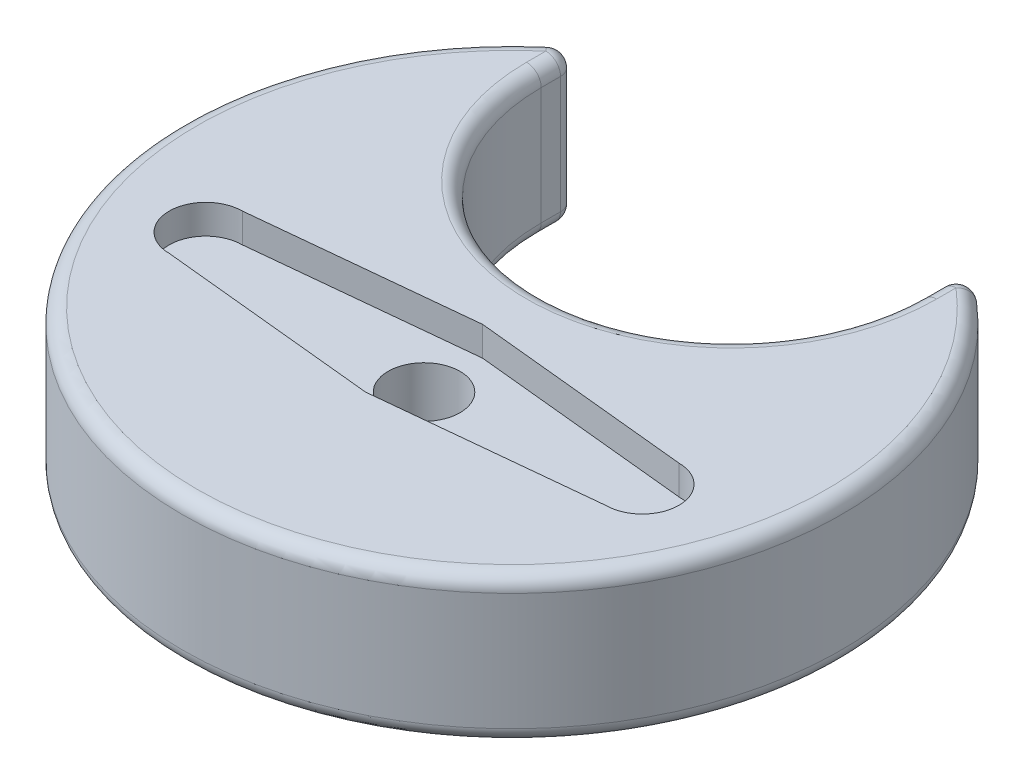
ISO-10303-21;
HEADER;
FILE_DESCRIPTION(('STEP AP214'),'2;1');
FILE_NAME('part.step','',(''),(''),'','','');
FILE_SCHEMA(('AUTOMOTIVE_DESIGN { 1 0 10303 214 1 1 1 1 }'));
ENDSEC;
DATA;
#1=APPLICATION_CONTEXT('core data for automotive mechanical design processes');
#2=APPLICATION_PROTOCOL_DEFINITION('international standard','automotive_design',2000,#1);
#3=PRODUCT_CONTEXT('',#1,'mechanical');
#4=PRODUCT('Part','Part','',(#3));
#5=PRODUCT_RELATED_PRODUCT_CATEGORY('part','',(#4));
#6=PRODUCT_DEFINITION_FORMATION('','',#4);
#7=PRODUCT_DEFINITION_CONTEXT('part definition',#1,'design');
#8=PRODUCT_DEFINITION('design','',#6,#7);
#9=PRODUCT_DEFINITION_SHAPE('','',#8);
#10=(LENGTH_UNIT() NAMED_UNIT(*) SI_UNIT(.MILLI.,.METRE.));
#11=(NAMED_UNIT(*) PLANE_ANGLE_UNIT() SI_UNIT($,.RADIAN.));
#12=(NAMED_UNIT(*) SI_UNIT($,.STERADIAN.) SOLID_ANGLE_UNIT());
#13=UNCERTAINTY_MEASURE_WITH_UNIT(LENGTH_MEASURE(1.E-05),#10,'distance_accuracy_value','');
#14=(GEOMETRIC_REPRESENTATION_CONTEXT(3) GLOBAL_UNCERTAINTY_ASSIGNED_CONTEXT((#13)) GLOBAL_UNIT_ASSIGNED_CONTEXT((#10,
#11,#12)) REPRESENTATION_CONTEXT('',''));
#15=CARTESIAN_POINT('',(0.,0.,0.));
#16=DIRECTION('',(0.,0.,1.));
#17=DIRECTION('',(1.,0.,0.));
#18=AXIS2_PLACEMENT_3D('',#15,#16,#17);
#19=CARTESIAN_POINT('',(14.,10.,-16.3171688720807));
#20=DIRECTION('',(0.,-1.,0.));
#21=DIRECTION('',(0.,0.,-1.));
#22=AXIS2_PLACEMENT_3D('',#19,#20,#21);
#23=CYLINDRICAL_SURFACE('',#22,1.);
#24=DIRECTION('',(0.,-1.,0.));
#25=VECTOR('',#24,1.);
#26=CARTESIAN_POINT('',(14.6511627906977,10.,-17.0761069591542));
#27=LINE('',#26,#25);
#28=CARTESIAN_POINT('',(14.6511627906977,9.,-17.0761069591542));
#29=VERTEX_POINT('',#28);
#30=CARTESIAN_POINT('',(14.6511627906977,0.999999999999999,-17.0761069591542));
#31=VERTEX_POINT('',#30);
#32=EDGE_CURVE('E228',#29,#31,#27,.T.);
#33=ORIENTED_EDGE('',*,*,#32,.T.);
#34=CARTESIAN_POINT('',(14.,0.999999999999999,-16.3171688720807));
#35=DIRECTION('',(0.,-1.,0.));
#36=DIRECTION('',(0.,0.,-1.));
#37=AXIS2_PLACEMENT_3D('',#34,#35,#36);
#38=CIRCLE('',#37,1.);
#39=CARTESIAN_POINT('',(13.,0.999999999999999,-16.3171688720807));
#40=VERTEX_POINT('',#39);
#41=EDGE_CURVE('E299',#31,#40,#38,.F.);
#42=ORIENTED_EDGE('',*,*,#41,.T.);
#43=DIRECTION('',(0.,-1.,0.));
#44=VECTOR('',#43,1.);
#45=CARTESIAN_POINT('',(13.,10.,-16.3171688720807));
#46=LINE('',#45,#44);
#47=CARTESIAN_POINT('',(13.,9.,-16.3171688720807));
#48=VERTEX_POINT('',#47);
#49=EDGE_CURVE('E259',#48,#40,#46,.T.);
#50=ORIENTED_EDGE('',*,*,#49,.F.);
#51=CARTESIAN_POINT('',(14.,9.,-16.3171688720807));
#52=DIRECTION('',(0.,-1.,0.));
#53=DIRECTION('',(0.,0.,-1.));
#54=AXIS2_PLACEMENT_3D('',#51,#52,#53);
#55=CIRCLE('',#54,1.);
#56=EDGE_CURVE('E296',#48,#29,#55,.T.);
#57=ORIENTED_EDGE('',*,*,#56,.T.);
#58=EDGE_LOOP('',(#33,#42,#50,#57));
#59=FACE_BOUND('',#58,.T.);
#60=ADVANCED_FACE('F45',(#59),#23,.T.);
#61=CARTESIAN_POINT('',(13.,10.,-15.));
#62=DIRECTION('',(1.,0.,0.));
#63=DIRECTION('',(0.,0.,-1.));
#64=AXIS2_PLACEMENT_3D('',#61,#62,#63);
#65=PLANE('',#64);
#66=ORIENTED_EDGE('',*,*,#49,.T.);
#67=DIRECTION('',(0.,0.,1.));
#68=VECTOR('',#67,1.);
#69=CARTESIAN_POINT('',(13.,0.999999999999999,-15.));
#70=LINE('',#69,#68);
#71=CARTESIAN_POINT('',(13.,0.999999999999999,-15.));
#72=VERTEX_POINT('',#71);
#73=EDGE_CURVE('E293',#40,#72,#70,.T.);
#74=ORIENTED_EDGE('',*,*,#73,.T.);
#75=DIRECTION('',(0.,-1.,0.));
#76=VECTOR('',#75,1.);
#77=CARTESIAN_POINT('',(13.,10.,-15.));
#78=LINE('',#77,#76);
#79=CARTESIAN_POINT('',(13.,9.,-15.));
#80=VERTEX_POINT('',#79);
#81=EDGE_CURVE('E255',#80,#72,#78,.T.);
#82=ORIENTED_EDGE('',*,*,#81,.F.);
#83=DIRECTION('',(0.,0.,1.));
#84=VECTOR('',#83,1.);
#85=CARTESIAN_POINT('',(13.,9.,-15.));
#86=LINE('',#85,#84);
#87=EDGE_CURVE('E290',#80,#48,#86,.F.);
#88=ORIENTED_EDGE('',*,*,#87,.T.);
#89=EDGE_LOOP('',(#66,#74,#82,#88));
#90=FACE_BOUND('',#89,.T.);
#91=ADVANCED_FACE('F373',(#90),#65,.F.);
#92=CARTESIAN_POINT('',(0.,10.,-15.));
#93=DIRECTION('',(0.,-1.,0.));
#94=DIRECTION('',(0.,0.,-1.));
#95=AXIS2_PLACEMENT_3D('',#92,#93,#94);
#96=CYLINDRICAL_SURFACE('',#95,13.);
#97=ORIENTED_EDGE('',*,*,#81,.T.);
#98=CARTESIAN_POINT('',(0.,0.999999999999999,-15.));
#99=DIRECTION('',(0.,-1.,0.));
#100=DIRECTION('',(0.,0.,-1.));
#101=AXIS2_PLACEMENT_3D('',#98,#99,#100);
#102=CIRCLE('',#101,13.);
#103=CARTESIAN_POINT('',(-13.,0.999999999999999,-15.));
#104=VERTEX_POINT('',#103);
#105=EDGE_CURVE('E315',#72,#104,#102,.T.);
#106=ORIENTED_EDGE('',*,*,#105,.T.);
#107=DIRECTION('',(0.,-1.,0.));
#108=VECTOR('',#107,1.);
#109=CARTESIAN_POINT('',(-13.,10.,-15.));
#110=LINE('',#109,#108);
#111=CARTESIAN_POINT('',(-13.,9.,-15.));
#112=VERTEX_POINT('',#111);
#113=EDGE_CURVE('E251',#112,#104,#110,.T.);
#114=ORIENTED_EDGE('',*,*,#113,.F.);
#115=CARTESIAN_POINT('',(0.,9.,-15.));
#116=DIRECTION('',(0.,-1.,0.));
#117=DIRECTION('',(0.,0.,-1.));
#118=AXIS2_PLACEMENT_3D('',#115,#116,#117);
#119=CIRCLE('',#118,13.);
#120=EDGE_CURVE('E312',#112,#80,#119,.F.);
#121=ORIENTED_EDGE('',*,*,#120,.T.);
#122=EDGE_LOOP('',(#97,#106,#114,#121));
#123=FACE_BOUND('',#122,.T.);
#124=ADVANCED_FACE('F430',(#123),#96,.F.);
#125=CARTESIAN_POINT('',(-13.,10.,-15.));
#126=DIRECTION('',(-1.,0.,0.));
#127=DIRECTION('',(0.,0.,1.));
#128=AXIS2_PLACEMENT_3D('',#125,#126,#127);
#129=PLANE('',#128);
#130=ORIENTED_EDGE('',*,*,#113,.T.);
#131=DIRECTION('',(0.,0.,-1.));
#132=VECTOR('',#131,1.);
#133=CARTESIAN_POINT('',(-13.,0.999999999999999,-16.3171688720807));
#134=LINE('',#133,#132);
#135=CARTESIAN_POINT('',(-13.,0.999999999999999,-16.3171688720807));
#136=VERTEX_POINT('',#135);
#137=EDGE_CURVE('E274',#104,#136,#134,.T.);
#138=ORIENTED_EDGE('',*,*,#137,.T.);
#139=DIRECTION('',(0.,-1.,0.));
#140=VECTOR('',#139,1.);
#141=CARTESIAN_POINT('',(-13.,10.,-16.3171688720807));
#142=LINE('',#141,#140);
#143=CARTESIAN_POINT('',(-13.,9.,-16.3171688720807));
#144=VERTEX_POINT('',#143);
#145=EDGE_CURVE('E247',#144,#136,#142,.T.);
#146=ORIENTED_EDGE('',*,*,#145,.F.);
#147=DIRECTION('',(0.,0.,-1.));
#148=VECTOR('',#147,1.);
#149=CARTESIAN_POINT('',(-13.,9.,-15.));
#150=LINE('',#149,#148);
#151=EDGE_CURVE('E271',#144,#112,#150,.F.);
#152=ORIENTED_EDGE('',*,*,#151,.T.);
#153=EDGE_LOOP('',(#130,#138,#146,#152));
#154=FACE_BOUND('',#153,.T.);
#155=ADVANCED_FACE('F422',(#154),#129,.F.);
#156=CARTESIAN_POINT('',(-14.,10.,-16.3171688720807));
#157=DIRECTION('',(0.,-1.,0.));
#158=DIRECTION('',(0.,0.,-1.));
#159=AXIS2_PLACEMENT_3D('',#156,#157,#158);
#160=CYLINDRICAL_SURFACE('',#159,1.);
#161=ORIENTED_EDGE('',*,*,#145,.T.);
#162=CARTESIAN_POINT('',(-14.,0.999999999999999,-16.3171688720807));
#163=DIRECTION('',(0.,-1.,0.));
#164=DIRECTION('',(0.,0.,-1.));
#165=AXIS2_PLACEMENT_3D('',#162,#163,#164);
#166=CIRCLE('',#165,1.);
#167=CARTESIAN_POINT('',(-14.6511627906977,0.999999999999999,-17.0761069591542));
#168=VERTEX_POINT('',#167);
#169=EDGE_CURVE('E267',#136,#168,#166,.F.);
#170=ORIENTED_EDGE('',*,*,#169,.T.);
#171=DIRECTION('',(0.,-1.,0.));
#172=VECTOR('',#171,1.);
#173=CARTESIAN_POINT('',(-14.6511627906977,10.,-17.0761069591542));
#174=LINE('',#173,#172);
#175=CARTESIAN_POINT('',(-14.6511627906977,9.,-17.0761069591542));
#176=VERTEX_POINT('',#175);
#177=EDGE_CURVE('E243',#176,#168,#174,.T.);
#178=ORIENTED_EDGE('',*,*,#177,.F.);
#179=CARTESIAN_POINT('',(-14.,9.,-16.3171688720807));
#180=DIRECTION('',(0.,-1.,0.));
#181=DIRECTION('',(0.,0.,-1.));
#182=AXIS2_PLACEMENT_3D('',#179,#180,#181);
#183=CIRCLE('',#182,1.);
#184=EDGE_CURVE('E263',#176,#144,#183,.T.);
#185=ORIENTED_EDGE('',*,*,#184,.T.);
#186=EDGE_LOOP('',(#161,#170,#178,#185));
#187=FACE_BOUND('',#186,.T.);
#188=ADVANCED_FACE('F403',(#187),#160,.T.);
#189=CARTESIAN_POINT('',(0.,10.,0.));
#190=DIRECTION('',(0.,-1.,0.));
#191=DIRECTION('',(0.,0.,-1.));
#192=AXIS2_PLACEMENT_3D('',#189,#190,#191);
#193=CYLINDRICAL_SURFACE('',#192,22.5);
#194=ORIENTED_EDGE('',*,*,#177,.T.);
#195=CARTESIAN_POINT('',(0.,0.999999999999999,0.));
#196=DIRECTION('',(0.,-1.,0.));
#197=DIRECTION('',(0.,0.,-1.));
#198=AXIS2_PLACEMENT_3D('',#195,#196,#197);
#199=CIRCLE('',#198,22.5);
#200=EDGE_CURVE('E11',#168,#31,#199,.F.);
#201=ORIENTED_EDGE('',*,*,#200,.T.);
#202=ORIENTED_EDGE('',*,*,#32,.F.);
#203=CARTESIAN_POINT('',(0.,9.,0.));
#204=DIRECTION('',(0.,-1.,0.));
#205=DIRECTION('',(0.,0.,-1.));
#206=AXIS2_PLACEMENT_3D('',#203,#204,#205);
#207=CIRCLE('',#206,22.5);
#208=EDGE_CURVE('E55',#29,#176,#207,.T.);
#209=ORIENTED_EDGE('',*,*,#208,.T.);
#210=EDGE_LOOP('',(#194,#201,#202,#209));
#211=FACE_BOUND('',#210,.T.);
#212=ADVANCED_FACE('F407',(#211),#193,.T.);
#213=CARTESIAN_POINT('',(14.,10.,-16.3171688720807));
#214=DIRECTION('',(0.,-1.,0.));
#215=DIRECTION('',(0.,0.,-1.));
#216=AXIS2_PLACEMENT_3D('',#213,#214,#215);
#217=PLANE('',#216);
#218=DIRECTION('',(0.,0.,1.));
#219=VECTOR('',#218,1.);
#220=CARTESIAN_POINT('',(14.,10.,-16.3171688720807));
#221=LINE('',#220,#219);
#222=CARTESIAN_POINT('',(14.,10.,-16.3171688720807));
#223=VERTEX_POINT('',#222);
#224=CARTESIAN_POINT('',(14.,10.,-15.));
#225=VERTEX_POINT('',#224);
#226=EDGE_CURVE('E68',#223,#225,#221,.T.);
#227=ORIENTED_EDGE('',*,*,#226,.T.);
#228=CARTESIAN_POINT('',(0.,10.,-15.));
#229=DIRECTION('',(0.,-1.,0.));
#230=DIRECTION('',(0.,0.,-1.));
#231=AXIS2_PLACEMENT_3D('',#228,#229,#230);
#232=CIRCLE('',#231,14.);
#233=CARTESIAN_POINT('',(-14.,10.,-15.));
#234=VERTEX_POINT('',#233);
#235=EDGE_CURVE('E63',#225,#234,#232,.T.);
#236=ORIENTED_EDGE('',*,*,#235,.T.);
#237=DIRECTION('',(0.,0.,-1.));
#238=VECTOR('',#237,1.);
#239=CARTESIAN_POINT('',(-14.,10.,-16.3171688720808));
#240=LINE('',#239,#238);
#241=CARTESIAN_POINT('',(-14.,10.,-16.3171688720807));
#242=VERTEX_POINT('',#241);
#243=EDGE_CURVE('E307',#234,#242,#240,.T.);
#244=ORIENTED_EDGE('',*,*,#243,.T.);
#245=CARTESIAN_POINT('',(0.,10.,0.));
#246=DIRECTION('',(0.,-1.,0.));
#247=DIRECTION('',(0.,0.,-1.));
#248=AXIS2_PLACEMENT_3D('',#245,#246,#247);
#249=CIRCLE('',#248,21.5);
#250=EDGE_CURVE('E302',#242,#223,#249,.F.);
#251=ORIENTED_EDGE('',*,*,#250,.T.);
#252=EDGE_LOOP('',(#227,#236,#244,#251));
#253=FACE_BOUND('',#252,.T.);
#254=DIRECTION('',(0.994970855144151,0.,0.100164851189008));
#255=VECTOR('',#254,1.);
#256=CARTESIAN_POINT('',(-14.9,10.,8.5));
#257=LINE('',#256,#255);
#258=CARTESIAN_POINT('',(-14.9,10.,8.50000000000001));
#259=VERTEX_POINT('',#258);
#260=CARTESIAN_POINT('',(0.,10.,10.));
#261=VERTEX_POINT('',#260);
#262=EDGE_CURVE('E211',#259,#261,#257,.T.);
#263=ORIENTED_EDGE('',*,*,#262,.F.);
#264=CARTESIAN_POINT('',(-14.9,10.,6.));
#265=DIRECTION('',(0.,1.,0.));
#266=DIRECTION('',(0.,0.,1.));
#267=AXIS2_PLACEMENT_3D('',#264,#265,#266);
#268=CIRCLE('',#267,2.5);
#269=CARTESIAN_POINT('',(-14.9,10.,3.5));
#270=VERTEX_POINT('',#269);
#271=EDGE_CURVE('E167',#270,#259,#268,.T.);
#272=ORIENTED_EDGE('',*,*,#271,.F.);
#273=DIRECTION('',(-0.994970855144151,0.,0.100164851189008));
#274=VECTOR('',#273,1.);
#275=CARTESIAN_POINT('',(-14.9,10.,3.5));
#276=LINE('',#275,#274);
#277=CARTESIAN_POINT('',(0.,10.,2.));
#278=VERTEX_POINT('',#277);
#279=EDGE_CURVE('E188',#278,#270,#276,.T.);
#280=ORIENTED_EDGE('',*,*,#279,.F.);
#281=DIRECTION('',(-0.994970855144151,0.,-0.100164851189008));
#282=VECTOR('',#281,1.);
#283=CARTESIAN_POINT('',(0.,10.,2.));
#284=LINE('',#283,#282);
#285=CARTESIAN_POINT('',(14.9,10.,3.5));
#286=VERTEX_POINT('',#285);
#287=EDGE_CURVE('E192',#286,#278,#284,.T.);
#288=ORIENTED_EDGE('',*,*,#287,.F.);
#289=CARTESIAN_POINT('',(14.9,10.,6.));
#290=DIRECTION('',(0.,1.,0.));
#291=DIRECTION('',(0.,0.,1.));
#292=AXIS2_PLACEMENT_3D('',#289,#290,#291);
#293=CIRCLE('',#292,2.5);
#294=CARTESIAN_POINT('',(14.9,10.,8.5));
#295=VERTEX_POINT('',#294);
#296=EDGE_CURVE('E218',#295,#286,#293,.T.);
#297=ORIENTED_EDGE('',*,*,#296,.F.);
#298=DIRECTION('',(0.994970855144151,0.,-0.100164851189009));
#299=VECTOR('',#298,1.);
#300=CARTESIAN_POINT('',(0.,10.,10.));
#301=LINE('',#300,#299);
#302=EDGE_CURVE('E214',#261,#295,#301,.T.);
#303=ORIENTED_EDGE('',*,*,#302,.F.);
#304=EDGE_LOOP('',(#263,#272,#280,#288,#297,#303));
#305=FACE_BOUND('',#304,.T.);
#306=ADVANCED_FACE('F511',(#253,#305),#217,.F.);
#307=CARTESIAN_POINT('',(14.,0.,-16.3171688720807));
#308=DIRECTION('',(0.,-1.,0.));
#309=DIRECTION('',(0.,0.,-1.));
#310=AXIS2_PLACEMENT_3D('',#307,#308,#309);
#311=PLANE('',#310);
#312=DIRECTION('',(0.,0.,-1.));
#313=VECTOR('',#312,1.);
#314=CARTESIAN_POINT('',(-14.,0.,-15.));
#315=LINE('',#314,#313);
#316=CARTESIAN_POINT('',(-14.,0.,-16.3171688720807));
#317=VERTEX_POINT('',#316);
#318=CARTESIAN_POINT('',(-14.,0.,-15.));
#319=VERTEX_POINT('',#318);
#320=EDGE_CURVE('E283',#317,#319,#315,.F.);
#321=ORIENTED_EDGE('',*,*,#320,.T.);
#322=CARTESIAN_POINT('',(0.,0.,-15.));
#323=DIRECTION('',(0.,-1.,0.));
#324=DIRECTION('',(0.,0.,-1.));
#325=AXIS2_PLACEMENT_3D('',#322,#323,#324);
#326=CIRCLE('',#325,14.);
#327=CARTESIAN_POINT('',(14.,0.,-15.));
#328=VERTEX_POINT('',#327);
#329=EDGE_CURVE('E287',#319,#328,#326,.F.);
#330=ORIENTED_EDGE('',*,*,#329,.T.);
#331=DIRECTION('',(0.,0.,1.));
#332=VECTOR('',#331,1.);
#333=CARTESIAN_POINT('',(14.,0.,-16.3171688720807));
#334=LINE('',#333,#332);
#335=CARTESIAN_POINT('',(14.,0.,-16.3171688720807));
#336=VERTEX_POINT('',#335);
#337=EDGE_CURVE('E280',#328,#336,#334,.F.);
#338=ORIENTED_EDGE('',*,*,#337,.T.);
#339=CARTESIAN_POINT('',(0.,0.,0.));
#340=DIRECTION('',(0.,-1.,0.));
#341=DIRECTION('',(0.,0.,-1.));
#342=AXIS2_PLACEMENT_3D('',#339,#340,#341);
#343=CIRCLE('',#342,21.5);
#344=EDGE_CURVE('E277',#336,#317,#343,.T.);
#345=ORIENTED_EDGE('',*,*,#344,.T.);
#346=EDGE_LOOP('',(#321,#330,#338,#345));
#347=FACE_BOUND('',#346,.T.);
#348=CARTESIAN_POINT('',(0.,0.,6.));
#349=DIRECTION('',(0.,1.,0.));
#350=DIRECTION('',(0.,0.,1.));
#351=AXIS2_PLACEMENT_3D('',#348,#349,#350);
#352=CIRCLE('',#351,2.45233506597262);
#353=CARTESIAN_POINT('',(0.,0.,8.45233506597262));
#354=VERTEX_POINT('',#353);
#355=EDGE_CURVE('E342',#354,#354,#352,.T.);
#356=ORIENTED_EDGE('',*,*,#355,.T.);
#357=EDGE_LOOP('',(#356));
#358=FACE_BOUND('',#357,.T.);
#359=ADVANCED_FACE('F389',(#347,#358),#311,.T.);
#360=CARTESIAN_POINT('',(-14.9,8.,6.));
#361=DIRECTION('',(0.,1.,0.));
#362=DIRECTION('',(0.,0.,1.));
#363=AXIS2_PLACEMENT_3D('',#360,#361,#362);
#364=CYLINDRICAL_SURFACE('',#363,2.5);
#365=ORIENTED_EDGE('',*,*,#271,.T.);
#366=DIRECTION('',(0.,1.,0.));
#367=VECTOR('',#366,1.);
#368=CARTESIAN_POINT('',(-14.9,8.,8.5));
#369=LINE('',#368,#367);
#370=CARTESIAN_POINT('',(-14.9,8.,8.5));
#371=VERTEX_POINT('',#370);
#372=EDGE_CURVE('E160',#371,#259,#369,.T.);
#373=ORIENTED_EDGE('',*,*,#372,.F.);
#374=CARTESIAN_POINT('',(-14.9,8.,6.));
#375=DIRECTION('',(0.,1.,0.));
#376=DIRECTION('',(0.,0.,1.));
#377=AXIS2_PLACEMENT_3D('',#374,#375,#376);
#378=CIRCLE('',#377,2.5);
#379=CARTESIAN_POINT('',(-14.9,8.,3.5));
#380=VERTEX_POINT('',#379);
#381=EDGE_CURVE('E164',#380,#371,#378,.T.);
#382=ORIENTED_EDGE('',*,*,#381,.F.);
#383=DIRECTION('',(0.,1.,0.));
#384=VECTOR('',#383,1.);
#385=CARTESIAN_POINT('',(-14.9,8.,3.5));
#386=LINE('',#385,#384);
#387=EDGE_CURVE('E225',#380,#270,#386,.T.);
#388=ORIENTED_EDGE('',*,*,#387,.T.);
#389=EDGE_LOOP('',(#365,#373,#382,#388));
#390=FACE_BOUND('',#389,.T.);
#391=ADVANCED_FACE('F162',(#390),#364,.F.);
#392=CARTESIAN_POINT('',(-14.9,8.,3.5));
#393=DIRECTION('',(-0.100164851189008,0.,-0.994970855144151));
#394=DIRECTION('',(-0.994970855144151,0.,0.100164851189008));
#395=AXIS2_PLACEMENT_3D('',#392,#393,#394);
#396=PLANE('',#395);
#397=ORIENTED_EDGE('',*,*,#279,.T.);
#398=ORIENTED_EDGE('',*,*,#387,.F.);
#399=DIRECTION('',(-0.994970855144151,0.,0.100164851189008));
#400=VECTOR('',#399,1.);
#401=CARTESIAN_POINT('',(-14.9,8.,3.5));
#402=LINE('',#401,#400);
#403=CARTESIAN_POINT('',(0.,8.,2.));
#404=VERTEX_POINT('',#403);
#405=EDGE_CURVE('E173',#404,#380,#402,.T.);
#406=ORIENTED_EDGE('',*,*,#405,.F.);
#407=DIRECTION('',(0.,1.,0.));
#408=VECTOR('',#407,1.);
#409=CARTESIAN_POINT('',(0.,8.,2.));
#410=LINE('',#409,#408);
#411=EDGE_CURVE('E229',#404,#278,#410,.T.);
#412=ORIENTED_EDGE('',*,*,#411,.T.);
#413=EDGE_LOOP('',(#397,#398,#406,#412));
#414=FACE_BOUND('',#413,.T.);
#415=ADVANCED_FACE('F565',(#414),#396,.F.);
#416=CARTESIAN_POINT('',(0.,8.,2.));
#417=DIRECTION('',(0.100164851189008,0.,-0.994970855144151));
#418=DIRECTION('',(-0.994970855144151,0.,-0.100164851189008));
#419=AXIS2_PLACEMENT_3D('',#416,#417,#418);
#420=PLANE('',#419);
#421=ORIENTED_EDGE('',*,*,#287,.T.);
#422=ORIENTED_EDGE('',*,*,#411,.F.);
#423=DIRECTION('',(-0.994970855144151,0.,-0.100164851189008));
#424=VECTOR('',#423,1.);
#425=CARTESIAN_POINT('',(0.,8.,2.));
#426=LINE('',#425,#424);
#427=CARTESIAN_POINT('',(14.9,8.,3.5));
#428=VERTEX_POINT('',#427);
#429=EDGE_CURVE('E204',#428,#404,#426,.T.);
#430=ORIENTED_EDGE('',*,*,#429,.F.);
#431=DIRECTION('',(0.,1.,0.));
#432=VECTOR('',#431,1.);
#433=CARTESIAN_POINT('',(14.9,8.,3.5));
#434=LINE('',#433,#432);
#435=EDGE_CURVE('E232',#428,#286,#434,.T.);
#436=ORIENTED_EDGE('',*,*,#435,.T.);
#437=EDGE_LOOP('',(#421,#422,#430,#436));
#438=FACE_BOUND('',#437,.T.);
#439=ADVANCED_FACE('F573',(#438),#420,.F.);
#440=CARTESIAN_POINT('',(14.9,8.,6.));
#441=DIRECTION('',(0.,1.,0.));
#442=DIRECTION('',(0.,0.,1.));
#443=AXIS2_PLACEMENT_3D('',#440,#441,#442);
#444=CYLINDRICAL_SURFACE('',#443,2.5);
#445=ORIENTED_EDGE('',*,*,#296,.T.);
#446=ORIENTED_EDGE('',*,*,#435,.F.);
#447=CARTESIAN_POINT('',(14.9,8.,6.));
#448=DIRECTION('',(0.,1.,0.));
#449=DIRECTION('',(0.,0.,1.));
#450=AXIS2_PLACEMENT_3D('',#447,#448,#449);
#451=CIRCLE('',#450,2.5);
#452=CARTESIAN_POINT('',(14.9,8.,8.5));
#453=VERTEX_POINT('',#452);
#454=EDGE_CURVE('E200',#453,#428,#451,.T.);
#455=ORIENTED_EDGE('',*,*,#454,.F.);
#456=DIRECTION('',(0.,1.,0.));
#457=VECTOR('',#456,1.);
#458=CARTESIAN_POINT('',(14.9,8.,8.5));
#459=LINE('',#458,#457);
#460=EDGE_CURVE('E235',#453,#295,#459,.T.);
#461=ORIENTED_EDGE('',*,*,#460,.T.);
#462=EDGE_LOOP('',(#445,#446,#455,#461));
#463=FACE_BOUND('',#462,.T.);
#464=ADVANCED_FACE('F582',(#463),#444,.F.);
#465=CARTESIAN_POINT('',(0.,8.,10.));
#466=DIRECTION('',(0.100164851189009,0.,0.994970855144151));
#467=DIRECTION('',(0.994970855144151,0.,-0.100164851189009));
#468=AXIS2_PLACEMENT_3D('',#465,#466,#467);
#469=PLANE('',#468);
#470=ORIENTED_EDGE('',*,*,#302,.T.);
#471=ORIENTED_EDGE('',*,*,#460,.F.);
#472=DIRECTION('',(0.994970855144151,0.,-0.100164851189009));
#473=VECTOR('',#472,1.);
#474=CARTESIAN_POINT('',(0.,8.,10.));
#475=LINE('',#474,#473);
#476=CARTESIAN_POINT('',(0.,8.,10.));
#477=VERTEX_POINT('',#476);
#478=EDGE_CURVE('E182',#477,#453,#475,.T.);
#479=ORIENTED_EDGE('',*,*,#478,.F.);
#480=DIRECTION('',(0.,1.,0.));
#481=VECTOR('',#480,1.);
#482=CARTESIAN_POINT('',(0.,8.,10.));
#483=LINE('',#482,#481);
#484=EDGE_CURVE('E172',#477,#261,#483,.T.);
#485=ORIENTED_EDGE('',*,*,#484,.T.);
#486=EDGE_LOOP('',(#470,#471,#479,#485));
#487=FACE_BOUND('',#486,.T.);
#488=ADVANCED_FACE('F591',(#487),#469,.F.);
#489=CARTESIAN_POINT('',(-14.9,8.,8.5));
#490=DIRECTION('',(-0.100164851189008,0.,0.994970855144151));
#491=DIRECTION('',(0.994970855144151,0.,0.100164851189008));
#492=AXIS2_PLACEMENT_3D('',#489,#490,#491);
#493=PLANE('',#492);
#494=ORIENTED_EDGE('',*,*,#262,.T.);
#495=ORIENTED_EDGE('',*,*,#484,.F.);
#496=DIRECTION('',(0.994970855144151,0.,0.100164851189008));
#497=VECTOR('',#496,1.);
#498=CARTESIAN_POINT('',(-14.9,8.,8.5));
#499=LINE('',#498,#497);
#500=EDGE_CURVE('E176',#371,#477,#499,.T.);
#501=ORIENTED_EDGE('',*,*,#500,.F.);
#502=ORIENTED_EDGE('',*,*,#372,.T.);
#503=EDGE_LOOP('',(#494,#495,#501,#502));
#504=FACE_BOUND('',#503,.T.);
#505=ADVANCED_FACE('F177',(#504),#493,.F.);
#506=CARTESIAN_POINT('',(-14.9,8.,6.));
#507=DIRECTION('',(0.,1.,0.));
#508=DIRECTION('',(0.,0.,1.));
#509=AXIS2_PLACEMENT_3D('',#506,#507,#508);
#510=PLANE('',#509);
#511=CARTESIAN_POINT('',(0.,8.,6.));
#512=DIRECTION('',(0.,1.,0.));
#513=DIRECTION('',(0.,0.,1.));
#514=AXIS2_PLACEMENT_3D('',#511,#512,#513);
#515=CIRCLE('',#514,2.45233506597262);
#516=CARTESIAN_POINT('',(0.,8.,8.45233506597262));
#517=VERTEX_POINT('',#516);
#518=EDGE_CURVE('E195',#517,#517,#515,.T.);
#519=ORIENTED_EDGE('',*,*,#518,.F.);
#520=EDGE_LOOP('',(#519));
#521=FACE_BOUND('',#520,.T.);
#522=ORIENTED_EDGE('',*,*,#381,.T.);
#523=ORIENTED_EDGE('',*,*,#500,.T.);
#524=ORIENTED_EDGE('',*,*,#478,.T.);
#525=ORIENTED_EDGE('',*,*,#454,.T.);
#526=ORIENTED_EDGE('',*,*,#429,.T.);
#527=ORIENTED_EDGE('',*,*,#405,.T.);
#528=EDGE_LOOP('',(#522,#523,#524,#525,#526,#527));
#529=FACE_BOUND('',#528,.T.);
#530=ADVANCED_FACE('F184',(#521,#529),#510,.T.);
#531=CARTESIAN_POINT('',(0.,0.,6.));
#532=DIRECTION('',(0.,1.,0.));
#533=DIRECTION('',(0.,0.,1.));
#534=AXIS2_PLACEMENT_3D('',#531,#532,#533);
#535=CYLINDRICAL_SURFACE('',#534,2.45233506597262);
#536=ORIENTED_EDGE('',*,*,#518,.T.);
#537=EDGE_LOOP('',(#536));
#538=FACE_BOUND('',#537,.T.);
#539=ORIENTED_EDGE('',*,*,#355,.F.);
#540=EDGE_LOOP('',(#539));
#541=FACE_BOUND('',#540,.T.);
#542=ADVANCED_FACE('F457',(#538,#541),#535,.F.);
#543=CARTESIAN_POINT('',(14.,0.999999999999999,-15.));
#544=DIRECTION('',(0.,0.,-1.));
#545=DIRECTION('',(-1.,0.,0.));
#546=AXIS2_PLACEMENT_3D('',#543,#544,#545);
#547=CYLINDRICAL_SURFACE('',#546,1.);
#548=CARTESIAN_POINT('',(14.,1.,-16.3171688720807));
#549=DIRECTION('',(0.,0.,-1.));
#550=DIRECTION('',(-1.,0.,0.));
#551=AXIS2_PLACEMENT_3D('',#548,#549,#550);
#552=CIRCLE('',#551,1.);
#553=EDGE_CURVE('E334',#336,#40,#552,.T.);
#554=ORIENTED_EDGE('',*,*,#553,.F.);
#555=ORIENTED_EDGE('',*,*,#337,.F.);
#556=CARTESIAN_POINT('',(14.,0.999999999999999,-15.));
#557=DIRECTION('',(0.,0.,1.));
#558=DIRECTION('',(1.,0.,0.));
#559=AXIS2_PLACEMENT_3D('',#556,#557,#558);
#560=CIRCLE('',#559,1.);
#561=EDGE_CURVE('E338',#72,#328,#560,.T.);
#562=ORIENTED_EDGE('',*,*,#561,.F.);
#563=ORIENTED_EDGE('',*,*,#73,.F.);
#564=EDGE_LOOP('',(#554,#555,#562,#563));
#565=FACE_BOUND('',#564,.T.);
#566=ADVANCED_FACE('F429',(#565),#547,.T.);
#567=CARTESIAN_POINT('',(0.,0.999999999999999,-15.));
#568=DIRECTION('',(0.,-1.,0.));
#569=DIRECTION('',(0.,0.,-1.));
#570=AXIS2_PLACEMENT_3D('',#567,#568,#569);
#571=TOROIDAL_SURFACE('',#570,14.,1.);
#572=ORIENTED_EDGE('',*,*,#561,.T.);
#573=ORIENTED_EDGE('',*,*,#329,.F.);
#574=CARTESIAN_POINT('',(-14.,0.999999999999999,-15.));
#575=DIRECTION('',(0.,0.,-1.));
#576=DIRECTION('',(0.,1.,0.));
#577=AXIS2_PLACEMENT_3D('',#574,#575,#576);
#578=CIRCLE('',#577,1.);
#579=EDGE_CURVE('E331',#104,#319,#578,.T.);
#580=ORIENTED_EDGE('',*,*,#579,.F.);
#581=ORIENTED_EDGE('',*,*,#105,.F.);
#582=EDGE_LOOP('',(#572,#573,#580,#581));
#583=FACE_BOUND('',#582,.T.);
#584=ADVANCED_FACE('F426',(#583),#571,.T.);
#585=CARTESIAN_POINT('',(14.,0.999999999999999,-16.3171688720807));
#586=DIRECTION('',(0.,-1.,0.));
#587=DIRECTION('',(0.,0.,-1.));
#588=AXIS2_PLACEMENT_3D('',#585,#586,#587);
#589=SPHERICAL_SURFACE('',#588,1.);
#590=ORIENTED_EDGE('',*,*,#553,.T.);
#591=ORIENTED_EDGE('',*,*,#41,.F.);
#592=CARTESIAN_POINT('',(14.,1.,-16.3171688720807));
#593=DIRECTION('',(0.758938087073512,0.,0.651162790697686));
#594=DIRECTION('',(0.651162790697686,0.,-0.758938087073512));
#595=AXIS2_PLACEMENT_3D('',#592,#593,#594);
#596=CIRCLE('',#595,1.);
#597=EDGE_CURVE('E327',#336,#31,#596,.T.);
#598=ORIENTED_EDGE('',*,*,#597,.F.);
#599=EDGE_LOOP('',(#590,#591,#598));
#600=FACE_BOUND('',#599,.T.);
#601=ADVANCED_FACE('F380',(#600),#589,.T.);
#602=CARTESIAN_POINT('',(-14.,0.999999999999999,-15.));
#603=DIRECTION('',(0.,0.,1.));
#604=DIRECTION('',(1.,0.,0.));
#605=AXIS2_PLACEMENT_3D('',#602,#603,#604);
#606=CYLINDRICAL_SURFACE('',#605,1.);
#607=ORIENTED_EDGE('',*,*,#579,.T.);
#608=ORIENTED_EDGE('',*,*,#320,.F.);
#609=CARTESIAN_POINT('',(-14.,0.999999999999999,-16.3171688720807));
#610=DIRECTION('',(0.,0.,-1.));
#611=DIRECTION('',(0.,1.,0.));
#612=AXIS2_PLACEMENT_3D('',#609,#610,#611);
#613=CIRCLE('',#612,1.);
#614=EDGE_CURVE('E323',#136,#317,#613,.T.);
#615=ORIENTED_EDGE('',*,*,#614,.F.);
#616=ORIENTED_EDGE('',*,*,#137,.F.);
#617=EDGE_LOOP('',(#607,#608,#615,#616));
#618=FACE_BOUND('',#617,.T.);
#619=ADVANCED_FACE('F394',(#618),#606,.T.);
#620=CARTESIAN_POINT('',(0.,0.999999999999999,0.));
#621=DIRECTION('',(0.,-1.,0.));
#622=DIRECTION('',(0.,0.,-1.));
#623=AXIS2_PLACEMENT_3D('',#620,#621,#622);
#624=TOROIDAL_SURFACE('',#623,21.5,1.);
#625=ORIENTED_EDGE('',*,*,#597,.T.);
#626=ORIENTED_EDGE('',*,*,#200,.F.);
#627=CARTESIAN_POINT('',(-14.,1.,-16.3171688720807));
#628=DIRECTION('',(0.758938087073524,0.,-0.651162790697672));
#629=DIRECTION('',(-0.651162790697672,0.,-0.758938087073524));
#630=AXIS2_PLACEMENT_3D('',#627,#628,#629);
#631=CIRCLE('',#630,1.);
#632=EDGE_CURVE('E320',#317,#168,#631,.T.);
#633=ORIENTED_EDGE('',*,*,#632,.F.);
#634=ORIENTED_EDGE('',*,*,#344,.F.);
#635=EDGE_LOOP('',(#625,#626,#633,#634));
#636=FACE_BOUND('',#635,.T.);
#637=ADVANCED_FACE('F385',(#636),#624,.T.);
#638=CARTESIAN_POINT('',(-14.,0.999999999999999,-16.3171688720807));
#639=DIRECTION('',(0.,-1.,0.));
#640=DIRECTION('',(0.,0.,-1.));
#641=AXIS2_PLACEMENT_3D('',#638,#639,#640);
#642=SPHERICAL_SURFACE('',#641,1.);
#643=ORIENTED_EDGE('',*,*,#169,.F.);
#644=ORIENTED_EDGE('',*,*,#614,.T.);
#645=ORIENTED_EDGE('',*,*,#632,.T.);
#646=EDGE_LOOP('',(#643,#644,#645));
#647=FACE_BOUND('',#646,.T.);
#648=ADVANCED_FACE('F400',(#647),#642,.T.);
#649=CARTESIAN_POINT('',(14.,9.,-16.3171688720807));
#650=DIRECTION('',(0.,0.,1.));
#651=DIRECTION('',(1.,0.,0.));
#652=AXIS2_PLACEMENT_3D('',#649,#650,#651);
#653=CYLINDRICAL_SURFACE('',#652,1.);
#654=CARTESIAN_POINT('',(14.,9.,-16.3171688720807));
#655=DIRECTION('',(0.,0.,-1.));
#656=DIRECTION('',(-1.,0.,0.));
#657=AXIS2_PLACEMENT_3D('',#654,#655,#656);
#658=CIRCLE('',#657,1.);
#659=EDGE_CURVE('E356',#48,#223,#658,.T.);
#660=ORIENTED_EDGE('',*,*,#659,.F.);
#661=ORIENTED_EDGE('',*,*,#87,.F.);
#662=CARTESIAN_POINT('',(14.,9.,-15.));
#663=DIRECTION('',(0.,0.,1.));
#664=DIRECTION('',(1.,0.,0.));
#665=AXIS2_PLACEMENT_3D('',#662,#663,#664);
#666=CIRCLE('',#665,1.);
#667=EDGE_CURVE('E49',#225,#80,#666,.T.);
#668=ORIENTED_EDGE('',*,*,#667,.F.);
#669=ORIENTED_EDGE('',*,*,#226,.F.);
#670=EDGE_LOOP('',(#660,#661,#668,#669));
#671=FACE_BOUND('',#670,.T.);
#672=ADVANCED_FACE('F47',(#671),#653,.T.);
#673=CARTESIAN_POINT('',(0.,9.,-15.));
#674=DIRECTION('',(0.,-1.,0.));
#675=DIRECTION('',(0.,0.,-1.));
#676=AXIS2_PLACEMENT_3D('',#673,#674,#675);
#677=TOROIDAL_SURFACE('',#676,14.,1.);
#678=ORIENTED_EDGE('',*,*,#667,.T.);
#679=ORIENTED_EDGE('',*,*,#120,.F.);
#680=CARTESIAN_POINT('',(-14.,9.,-15.));
#681=DIRECTION('',(0.,0.,-1.));
#682=DIRECTION('',(-1.,0.,0.));
#683=AXIS2_PLACEMENT_3D('',#680,#681,#682);
#684=CIRCLE('',#683,1.);
#685=EDGE_CURVE('E353',#234,#112,#684,.T.);
#686=ORIENTED_EDGE('',*,*,#685,.F.);
#687=ORIENTED_EDGE('',*,*,#235,.F.);
#688=EDGE_LOOP('',(#678,#679,#686,#687));
#689=FACE_BOUND('',#688,.T.);
#690=ADVANCED_FACE('F367',(#689),#677,.T.);
#691=CARTESIAN_POINT('',(14.,9.,-16.3171688720807));
#692=DIRECTION('',(0.,-1.,0.));
#693=DIRECTION('',(0.,0.,-1.));
#694=AXIS2_PLACEMENT_3D('',#691,#692,#693);
#695=SPHERICAL_SURFACE('',#694,1.);
#696=ORIENTED_EDGE('',*,*,#56,.F.);
#697=ORIENTED_EDGE('',*,*,#659,.T.);
#698=CARTESIAN_POINT('',(14.,9.,-16.3171688720807));
#699=DIRECTION('',(0.758938087073512,0.,0.651162790697686));
#700=DIRECTION('',(0.651162790697686,0.,-0.758938087073512));
#701=AXIS2_PLACEMENT_3D('',#698,#699,#700);
#702=CIRCLE('',#701,1.);
#703=EDGE_CURVE('E349',#29,#223,#702,.T.);
#704=ORIENTED_EDGE('',*,*,#703,.F.);
#705=EDGE_LOOP('',(#696,#697,#704));
#706=FACE_BOUND('',#705,.T.);
#707=ADVANCED_FACE('F464',(#706),#695,.T.);
#708=CARTESIAN_POINT('',(-14.,9.,-16.3171688720808));
#709=DIRECTION('',(0.,0.,-1.));
#710=DIRECTION('',(-1.,0.,0.));
#711=AXIS2_PLACEMENT_3D('',#708,#709,#710);
#712=CYLINDRICAL_SURFACE('',#711,1.);
#713=ORIENTED_EDGE('',*,*,#685,.T.);
#714=ORIENTED_EDGE('',*,*,#151,.F.);
#715=CARTESIAN_POINT('',(-14.,9.,-16.3171688720807));
#716=DIRECTION('',(0.,0.,-1.));
#717=DIRECTION('',(-1.,0.,0.));
#718=AXIS2_PLACEMENT_3D('',#715,#716,#717);
#719=CIRCLE('',#718,1.);
#720=EDGE_CURVE('E346',#242,#144,#719,.T.);
#721=ORIENTED_EDGE('',*,*,#720,.F.);
#722=ORIENTED_EDGE('',*,*,#243,.F.);
#723=EDGE_LOOP('',(#713,#714,#721,#722));
#724=FACE_BOUND('',#723,.T.);
#725=ADVANCED_FACE('F419',(#724),#712,.T.);
#726=CARTESIAN_POINT('',(0.,9.,0.));
#727=DIRECTION('',(0.,-1.,0.));
#728=DIRECTION('',(0.,0.,-1.));
#729=AXIS2_PLACEMENT_3D('',#726,#727,#728);
#730=TOROIDAL_SURFACE('',#729,21.5,1.);
#731=ORIENTED_EDGE('',*,*,#703,.T.);
#732=ORIENTED_EDGE('',*,*,#250,.F.);
#733=CARTESIAN_POINT('',(-14.,9.,-16.3171688720807));
#734=DIRECTION('',(0.758938087073522,0.,-0.651162790697674));
#735=DIRECTION('',(-0.651162790697674,0.,-0.758938087073522));
#736=AXIS2_PLACEMENT_3D('',#733,#734,#735);
#737=CIRCLE('',#736,1.);
#738=EDGE_CURVE('E343',#176,#242,#737,.T.);
#739=ORIENTED_EDGE('',*,*,#738,.F.);
#740=ORIENTED_EDGE('',*,*,#208,.F.);
#741=EDGE_LOOP('',(#731,#732,#739,#740));
#742=FACE_BOUND('',#741,.T.);
#743=ADVANCED_FACE('F411',(#742),#730,.T.);
#744=CARTESIAN_POINT('',(-14.,9.,-16.3171688720807));
#745=DIRECTION('',(0.,-1.,0.));
#746=DIRECTION('',(0.,0.,-1.));
#747=AXIS2_PLACEMENT_3D('',#744,#745,#746);
#748=SPHERICAL_SURFACE('',#747,1.);
#749=ORIENTED_EDGE('',*,*,#720,.T.);
#750=ORIENTED_EDGE('',*,*,#184,.F.);
#751=ORIENTED_EDGE('',*,*,#738,.T.);
#752=EDGE_LOOP('',(#749,#750,#751));
#753=FACE_BOUND('',#752,.T.);
#754=ADVANCED_FACE('F415',(#753),#748,.T.);
#755=CLOSED_SHELL('',(#60,#91,#124,#155,#188,#212,#306,#359,#391,#415,#439,#464,#488,#505,#530,
#542,#566,#584,#601,#619,#637,#648,#672,#690,#707,#725,#743,#754));
#756=MANIFOLD_SOLID_BREP('B2',#755);
#757=ADVANCED_BREP_SHAPE_REPRESENTATION('',(#18,#756),#14);
#758=SHAPE_DEFINITION_REPRESENTATION(#9,#757);
ENDSEC;
END-ISO-10303-21;
